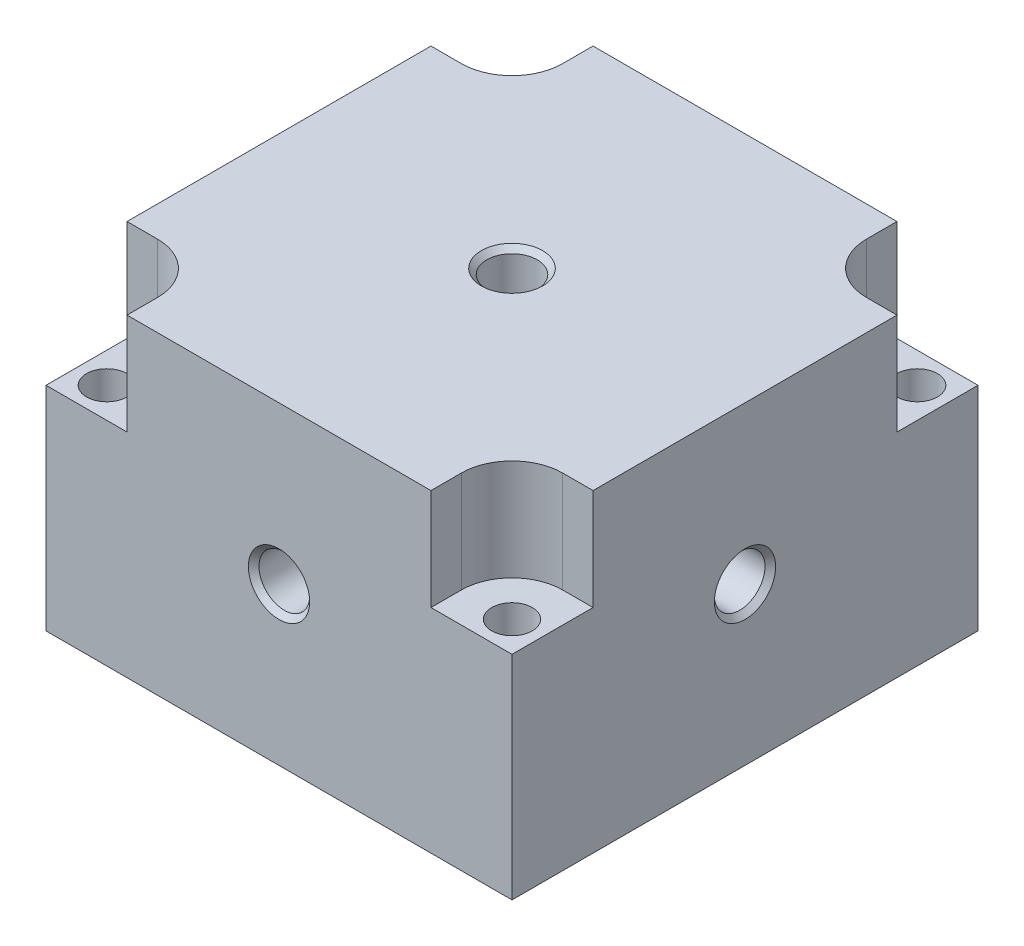
ISO-10303-21;
HEADER;
FILE_DESCRIPTION(('STEP AP214'),'2;1');
FILE_NAME('part.step','',(''),(''),'','','');
FILE_SCHEMA(('AUTOMOTIVE_DESIGN { 1 0 10303 214 1 1 1 1 }'));
ENDSEC;
DATA;
#1=APPLICATION_CONTEXT('core data for automotive mechanical design processes');
#2=APPLICATION_PROTOCOL_DEFINITION('international standard','automotive_design',2000,#1);
#3=PRODUCT_CONTEXT('',#1,'mechanical');
#4=PRODUCT('Part','Part','',(#3));
#5=PRODUCT_RELATED_PRODUCT_CATEGORY('part','',(#4));
#6=PRODUCT_DEFINITION_FORMATION('','',#4);
#7=PRODUCT_DEFINITION_CONTEXT('part definition',#1,'design');
#8=PRODUCT_DEFINITION('design','',#6,#7);
#9=PRODUCT_DEFINITION_SHAPE('','',#8);
#10=(LENGTH_UNIT() NAMED_UNIT(*) SI_UNIT(.MILLI.,.METRE.));
#11=(NAMED_UNIT(*) PLANE_ANGLE_UNIT() SI_UNIT($,.RADIAN.));
#12=(NAMED_UNIT(*) SI_UNIT($,.STERADIAN.) SOLID_ANGLE_UNIT());
#13=UNCERTAINTY_MEASURE_WITH_UNIT(LENGTH_MEASURE(1.E-05),#10,'distance_accuracy_value','');
#14=(GEOMETRIC_REPRESENTATION_CONTEXT(3) GLOBAL_UNCERTAINTY_ASSIGNED_CONTEXT((#13)) GLOBAL_UNIT_ASSIGNED_CONTEXT((#10,
#11,#12)) REPRESENTATION_CONTEXT('',''));
#15=CARTESIAN_POINT('',(0.,0.,0.));
#16=DIRECTION('',(0.,0.,1.));
#17=DIRECTION('',(1.,0.,0.));
#18=AXIS2_PLACEMENT_3D('',#15,#16,#17);
#19=CARTESIAN_POINT('',(23.,15.5,-23.));
#20=DIRECTION('',(-1.,0.,0.));
#21=DIRECTION('',(0.,0.,1.));
#22=AXIS2_PLACEMENT_3D('',#19,#20,#21);
#23=PLANE('',#22);
#24=CARTESIAN_POINT('',(23.,0.,0.));
#25=DIRECTION('',(1.,0.,0.));
#26=DIRECTION('',(0.,0.,-1.));
#27=AXIS2_PLACEMENT_3D('',#24,#25,#26);
#28=CIRCLE('',#27,3.025);
#29=CARTESIAN_POINT('',(23.,0.,-3.02500000000008));
#30=VERTEX_POINT('',#29);
#31=EDGE_CURVE('E247',#30,#30,#28,.T.);
#32=ORIENTED_EDGE('',*,*,#31,.F.);
#33=EDGE_LOOP('',(#32));
#34=FACE_BOUND('',#33,.T.);
#35=DIRECTION('',(0.,0.,-1.));
#36=VECTOR('',#35,1.);
#37=CARTESIAN_POINT('',(23.,15.5,-23.));
#38=LINE('',#37,#36);
#39=CARTESIAN_POINT('',(23.,15.5,15.));
#40=VERTEX_POINT('',#39);
#41=CARTESIAN_POINT('',(23.,15.5,-15.));
#42=VERTEX_POINT('',#41);
#43=EDGE_CURVE('E468',#40,#42,#38,.T.);
#44=ORIENTED_EDGE('',*,*,#43,.F.);
#45=DIRECTION('',(0.,1.,0.));
#46=VECTOR('',#45,1.);
#47=CARTESIAN_POINT('',(23.,5.5,15.));
#48=LINE('',#47,#46);
#49=CARTESIAN_POINT('',(23.,5.5,15.));
#50=VERTEX_POINT('',#49);
#51=EDGE_CURVE('E337',#50,#40,#48,.T.);
#52=ORIENTED_EDGE('',*,*,#51,.F.);
#53=DIRECTION('',(0.,0.,-1.));
#54=VECTOR('',#53,1.);
#55=CARTESIAN_POINT('',(23.,5.5,15.));
#56=LINE('',#55,#54);
#57=CARTESIAN_POINT('',(23.,5.5,23.));
#58=VERTEX_POINT('',#57);
#59=EDGE_CURVE('E315',#58,#50,#56,.T.);
#60=ORIENTED_EDGE('',*,*,#59,.F.);
#61=DIRECTION('',(0.,-1.,0.));
#62=VECTOR('',#61,1.);
#63=CARTESIAN_POINT('',(23.,15.5,23.));
#64=LINE('',#63,#62);
#65=CARTESIAN_POINT('',(23.,-15.5,23.));
#66=VERTEX_POINT('',#65);
#67=EDGE_CURVE('E485',#58,#66,#64,.T.);
#68=ORIENTED_EDGE('',*,*,#67,.T.);
#69=DIRECTION('',(0.,0.,-1.));
#70=VECTOR('',#69,1.);
#71=CARTESIAN_POINT('',(23.,-15.5,-23.));
#72=LINE('',#71,#70);
#73=CARTESIAN_POINT('',(23.,-15.5,-23.));
#74=VERTEX_POINT('',#73);
#75=EDGE_CURVE('E457',#66,#74,#72,.T.);
#76=ORIENTED_EDGE('',*,*,#75,.T.);
#77=DIRECTION('',(0.,-1.,0.));
#78=VECTOR('',#77,1.);
#79=CARTESIAN_POINT('',(23.,15.5,-23.));
#80=LINE('',#79,#78);
#81=CARTESIAN_POINT('',(23.,5.5,-23.));
#82=VERTEX_POINT('',#81);
#83=EDGE_CURVE('E13',#82,#74,#80,.T.);
#84=ORIENTED_EDGE('',*,*,#83,.F.);
#85=DIRECTION('',(0.,0.,-1.));
#86=VECTOR('',#85,1.);
#87=CARTESIAN_POINT('',(23.,5.5,-15.));
#88=LINE('',#87,#86);
#89=CARTESIAN_POINT('',(23.,5.5,-15.));
#90=VERTEX_POINT('',#89);
#91=EDGE_CURVE('E435',#90,#82,#88,.T.);
#92=ORIENTED_EDGE('',*,*,#91,.F.);
#93=DIRECTION('',(0.,1.,0.));
#94=VECTOR('',#93,1.);
#95=CARTESIAN_POINT('',(23.,5.5,-15.));
#96=LINE('',#95,#94);
#97=EDGE_CURVE('E461',#90,#42,#96,.T.);
#98=ORIENTED_EDGE('',*,*,#97,.T.);
#99=EDGE_LOOP('',(#44,#52,#60,#68,#76,#84,#92,#98));
#100=FACE_BOUND('',#99,.T.);
#101=ADVANCED_FACE('F54',(#34,#100),#23,.F.);
#102=CARTESIAN_POINT('',(-23.,15.5,-23.));
#103=DIRECTION('',(0.,0.,1.));
#104=DIRECTION('',(1.,0.,0.));
#105=AXIS2_PLACEMENT_3D('',#102,#103,#104);
#106=PLANE('',#105);
#107=CARTESIAN_POINT('',(0.,0.,-23.));
#108=DIRECTION('',(0.,0.,-1.));
#109=DIRECTION('',(-1.,0.,0.));
#110=AXIS2_PLACEMENT_3D('',#107,#108,#109);
#111=CIRCLE('',#110,3.025);
#112=CARTESIAN_POINT('',(-3.025,0.,-23.));
#113=VERTEX_POINT('',#112);
#114=EDGE_CURVE('E235',#113,#113,#111,.T.);
#115=ORIENTED_EDGE('',*,*,#114,.F.);
#116=EDGE_LOOP('',(#115));
#117=FACE_BOUND('',#116,.T.);
#118=DIRECTION('',(-1.,0.,0.));
#119=VECTOR('',#118,1.);
#120=CARTESIAN_POINT('',(-15.,5.5,-23.));
#121=LINE('',#120,#119);
#122=CARTESIAN_POINT('',(-15.,5.5,-23.));
#123=VERTEX_POINT('',#122);
#124=CARTESIAN_POINT('',(-23.,5.5,-23.));
#125=VERTEX_POINT('',#124);
#126=EDGE_CURVE('E396',#123,#125,#121,.T.);
#127=ORIENTED_EDGE('',*,*,#126,.F.);
#128=DIRECTION('',(0.,1.,0.));
#129=VECTOR('',#128,1.);
#130=CARTESIAN_POINT('',(-15.,5.5,-23.));
#131=LINE('',#130,#129);
#132=CARTESIAN_POINT('',(-15.,15.5,-23.));
#133=VERTEX_POINT('',#132);
#134=EDGE_CURVE('E420',#123,#133,#131,.T.);
#135=ORIENTED_EDGE('',*,*,#134,.T.);
#136=DIRECTION('',(-1.,0.,0.));
#137=VECTOR('',#136,1.);
#138=CARTESIAN_POINT('',(-23.,15.5,-23.));
#139=LINE('',#138,#137);
#140=CARTESIAN_POINT('',(15.,15.5,-23.));
#141=VERTEX_POINT('',#140);
#142=EDGE_CURVE('E472',#141,#133,#139,.T.);
#143=ORIENTED_EDGE('',*,*,#142,.F.);
#144=DIRECTION('',(0.,1.,0.));
#145=VECTOR('',#144,1.);
#146=CARTESIAN_POINT('',(15.,5.5,-23.));
#147=LINE('',#146,#145);
#148=CARTESIAN_POINT('',(15.,5.5,-23.));
#149=VERTEX_POINT('',#148);
#150=EDGE_CURVE('E458',#149,#141,#147,.T.);
#151=ORIENTED_EDGE('',*,*,#150,.F.);
#152=DIRECTION('',(-1.,0.,0.));
#153=VECTOR('',#152,1.);
#154=CARTESIAN_POINT('',(15.,5.5,-23.));
#155=LINE('',#154,#153);
#156=EDGE_CURVE('E438',#82,#149,#155,.T.);
#157=ORIENTED_EDGE('',*,*,#156,.F.);
#158=ORIENTED_EDGE('',*,*,#83,.T.);
#159=DIRECTION('',(-1.,0.,0.));
#160=VECTOR('',#159,1.);
#161=CARTESIAN_POINT('',(-23.,-15.5,-23.));
#162=LINE('',#161,#160);
#163=CARTESIAN_POINT('',(-23.,-15.5,-23.));
#164=VERTEX_POINT('',#163);
#165=EDGE_CURVE('E489',#74,#164,#162,.T.);
#166=ORIENTED_EDGE('',*,*,#165,.T.);
#167=DIRECTION('',(0.,-1.,0.));
#168=VECTOR('',#167,1.);
#169=CARTESIAN_POINT('',(-23.,15.5,-23.));
#170=LINE('',#169,#168);
#171=EDGE_CURVE('E62',#125,#164,#170,.T.);
#172=ORIENTED_EDGE('',*,*,#171,.F.);
#173=EDGE_LOOP('',(#127,#135,#143,#151,#157,#158,#166,#172));
#174=FACE_BOUND('',#173,.T.);
#175=ADVANCED_FACE('F518',(#117,#174),#106,.F.);
#176=CARTESIAN_POINT('',(-23.,15.5,-23.));
#177=DIRECTION('',(1.,0.,0.));
#178=DIRECTION('',(0.,0.,-1.));
#179=AXIS2_PLACEMENT_3D('',#176,#177,#178);
#180=PLANE('',#179);
#181=CARTESIAN_POINT('',(-23.,0.,2.40912212380176E-13));
#182=DIRECTION('',(-1.,0.,0.));
#183=DIRECTION('',(0.,0.,1.));
#184=AXIS2_PLACEMENT_3D('',#181,#182,#183);
#185=CIRCLE('',#184,3.025);
#186=CARTESIAN_POINT('',(-23.,0.,3.02500000000024));
#187=VERTEX_POINT('',#186);
#188=EDGE_CURVE('E214',#187,#187,#185,.T.);
#189=ORIENTED_EDGE('',*,*,#188,.F.);
#190=EDGE_LOOP('',(#189));
#191=FACE_BOUND('',#190,.T.);
#192=DIRECTION('',(0.,0.,1.));
#193=VECTOR('',#192,1.);
#194=CARTESIAN_POINT('',(-23.,15.5,-23.));
#195=LINE('',#194,#193);
#196=CARTESIAN_POINT('',(-23.,15.5,-15.));
#197=VERTEX_POINT('',#196);
#198=CARTESIAN_POINT('',(-23.,15.5,15.));
#199=VERTEX_POINT('',#198);
#200=EDGE_CURVE('E477',#197,#199,#195,.T.);
#201=ORIENTED_EDGE('',*,*,#200,.F.);
#202=DIRECTION('',(0.,1.,0.));
#203=VECTOR('',#202,1.);
#204=CARTESIAN_POINT('',(-23.,5.5,-15.));
#205=LINE('',#204,#203);
#206=CARTESIAN_POINT('',(-23.,5.5,-15.));
#207=VERTEX_POINT('',#206);
#208=EDGE_CURVE('E417',#207,#197,#205,.T.);
#209=ORIENTED_EDGE('',*,*,#208,.F.);
#210=DIRECTION('',(0.,0.,1.));
#211=VECTOR('',#210,1.);
#212=CARTESIAN_POINT('',(-23.,5.5,-15.));
#213=LINE('',#212,#211);
#214=EDGE_CURVE('E399',#125,#207,#213,.T.);
#215=ORIENTED_EDGE('',*,*,#214,.F.);
#216=ORIENTED_EDGE('',*,*,#171,.T.);
#217=DIRECTION('',(0.,0.,1.));
#218=VECTOR('',#217,1.);
#219=CARTESIAN_POINT('',(-23.,-15.5,-23.));
#220=LINE('',#219,#218);
#221=CARTESIAN_POINT('',(-23.,-15.5,23.));
#222=VERTEX_POINT('',#221);
#223=EDGE_CURVE('E493',#164,#222,#220,.T.);
#224=ORIENTED_EDGE('',*,*,#223,.T.);
#225=DIRECTION('',(0.,-1.,0.));
#226=VECTOR('',#225,1.);
#227=CARTESIAN_POINT('',(-23.,15.5,23.));
#228=LINE('',#227,#226);
#229=CARTESIAN_POINT('',(-23.,5.5,23.));
#230=VERTEX_POINT('',#229);
#231=EDGE_CURVE('E502',#230,#222,#228,.T.);
#232=ORIENTED_EDGE('',*,*,#231,.F.);
#233=DIRECTION('',(0.,0.,1.));
#234=VECTOR('',#233,1.);
#235=CARTESIAN_POINT('',(-23.,5.5,15.));
#236=LINE('',#235,#234);
#237=CARTESIAN_POINT('',(-23.,5.5,15.));
#238=VERTEX_POINT('',#237);
#239=EDGE_CURVE('E356',#238,#230,#236,.T.);
#240=ORIENTED_EDGE('',*,*,#239,.F.);
#241=DIRECTION('',(0.,1.,0.));
#242=VECTOR('',#241,1.);
#243=CARTESIAN_POINT('',(-23.,5.5,15.));
#244=LINE('',#243,#242);
#245=EDGE_CURVE('E381',#238,#199,#244,.T.);
#246=ORIENTED_EDGE('',*,*,#245,.T.);
#247=EDGE_LOOP('',(#201,#209,#215,#216,#224,#232,#240,#246));
#248=FACE_BOUND('',#247,.T.);
#249=ADVANCED_FACE('F510',(#191,#248),#180,.F.);
#250=CARTESIAN_POINT('',(-23.,15.5,23.));
#251=DIRECTION('',(0.,0.,-1.));
#252=DIRECTION('',(-1.,0.,0.));
#253=AXIS2_PLACEMENT_3D('',#250,#251,#252);
#254=PLANE('',#253);
#255=CARTESIAN_POINT('',(0.,0.,23.));
#256=DIRECTION('',(0.,0.,1.));
#257=DIRECTION('',(1.,0.,0.));
#258=AXIS2_PLACEMENT_3D('',#255,#256,#257);
#259=CIRCLE('',#258,3.025);
#260=CARTESIAN_POINT('',(3.025,0.,23.));
#261=VERTEX_POINT('',#260);
#262=EDGE_CURVE('E259',#261,#261,#259,.T.);
#263=ORIENTED_EDGE('',*,*,#262,.F.);
#264=EDGE_LOOP('',(#263));
#265=FACE_BOUND('',#264,.T.);
#266=DIRECTION('',(1.,0.,0.));
#267=VECTOR('',#266,1.);
#268=CARTESIAN_POINT('',(-23.,15.5,23.));
#269=LINE('',#268,#267);
#270=CARTESIAN_POINT('',(-15.,15.5,23.));
#271=VERTEX_POINT('',#270);
#272=CARTESIAN_POINT('',(15.,15.5,23.));
#273=VERTEX_POINT('',#272);
#274=EDGE_CURVE('E481',#271,#273,#269,.T.);
#275=ORIENTED_EDGE('',*,*,#274,.F.);
#276=DIRECTION('',(0.,1.,0.));
#277=VECTOR('',#276,1.);
#278=CARTESIAN_POINT('',(-15.,5.5,23.));
#279=LINE('',#278,#277);
#280=CARTESIAN_POINT('',(-15.,5.5,23.));
#281=VERTEX_POINT('',#280);
#282=EDGE_CURVE('E378',#281,#271,#279,.T.);
#283=ORIENTED_EDGE('',*,*,#282,.F.);
#284=DIRECTION('',(1.,0.,0.));
#285=VECTOR('',#284,1.);
#286=CARTESIAN_POINT('',(-15.,5.5,23.));
#287=LINE('',#286,#285);
#288=EDGE_CURVE('E359',#230,#281,#287,.T.);
#289=ORIENTED_EDGE('',*,*,#288,.F.);
#290=ORIENTED_EDGE('',*,*,#231,.T.);
#291=DIRECTION('',(1.,0.,0.));
#292=VECTOR('',#291,1.);
#293=CARTESIAN_POINT('',(-23.,-15.5,23.));
#294=LINE('',#293,#292);
#295=EDGE_CURVE('E473',#222,#66,#294,.T.);
#296=ORIENTED_EDGE('',*,*,#295,.T.);
#297=ORIENTED_EDGE('',*,*,#67,.F.);
#298=DIRECTION('',(1.,0.,0.));
#299=VECTOR('',#298,1.);
#300=CARTESIAN_POINT('',(15.,5.5,23.));
#301=LINE('',#300,#299);
#302=CARTESIAN_POINT('',(15.,5.5,23.));
#303=VERTEX_POINT('',#302);
#304=EDGE_CURVE('E312',#303,#58,#301,.T.);
#305=ORIENTED_EDGE('',*,*,#304,.F.);
#306=DIRECTION('',(0.,1.,0.));
#307=VECTOR('',#306,1.);
#308=CARTESIAN_POINT('',(15.,5.5,23.));
#309=LINE('',#308,#307);
#310=EDGE_CURVE('E340',#303,#273,#309,.T.);
#311=ORIENTED_EDGE('',*,*,#310,.T.);
#312=EDGE_LOOP('',(#275,#283,#289,#290,#296,#297,#305,#311));
#313=FACE_BOUND('',#312,.T.);
#314=ADVANCED_FACE('F527',(#265,#313),#254,.F.);
#315=CARTESIAN_POINT('',(0.,15.5,0.));
#316=DIRECTION('',(0.,1.,0.));
#317=DIRECTION('',(0.,0.,1.));
#318=AXIS2_PLACEMENT_3D('',#315,#316,#317);
#319=PLANE('',#318);
#320=CARTESIAN_POINT('',(0.,15.5,0.));
#321=DIRECTION('',(0.,1.,0.));
#322=DIRECTION('',(0.,0.,1.));
#323=AXIS2_PLACEMENT_3D('',#320,#321,#322);
#324=CIRCLE('',#323,3.025);
#325=CARTESIAN_POINT('',(0.,15.5,3.025));
#326=VERTEX_POINT('',#325);
#327=EDGE_CURVE('E224',#326,#326,#324,.T.);
#328=ORIENTED_EDGE('',*,*,#327,.F.);
#329=EDGE_LOOP('',(#328));
#330=FACE_BOUND('',#329,.T.);
#331=DIRECTION('',(1.,0.,0.));
#332=VECTOR('',#331,1.);
#333=CARTESIAN_POINT('',(-20.,15.5,-15.));
#334=LINE('',#333,#332);
#335=CARTESIAN_POINT('',(-20.,15.5,-15.));
#336=VERTEX_POINT('',#335);
#337=EDGE_CURVE('E392',#197,#336,#334,.T.);
#338=ORIENTED_EDGE('',*,*,#337,.F.);
#339=ORIENTED_EDGE('',*,*,#200,.T.);
#340=DIRECTION('',(-1.,0.,0.));
#341=VECTOR('',#340,1.);
#342=CARTESIAN_POINT('',(-20.,15.5,15.));
#343=LINE('',#342,#341);
#344=CARTESIAN_POINT('',(-20.,15.5,15.));
#345=VERTEX_POINT('',#344);
#346=EDGE_CURVE('E369',#345,#199,#343,.T.);
#347=ORIENTED_EDGE('',*,*,#346,.F.);
#348=CARTESIAN_POINT('',(-20.,15.5,20.));
#349=DIRECTION('',(0.,1.,0.));
#350=DIRECTION('',(0.,0.,1.));
#351=AXIS2_PLACEMENT_3D('',#348,#349,#350);
#352=CIRCLE('',#351,5.);
#353=CARTESIAN_POINT('',(-15.,15.5,20.));
#354=VERTEX_POINT('',#353);
#355=EDGE_CURVE('E77',#354,#345,#352,.T.);
#356=ORIENTED_EDGE('',*,*,#355,.F.);
#357=DIRECTION('',(0.,0.,-1.));
#358=VECTOR('',#357,1.);
#359=CARTESIAN_POINT('',(-15.,15.5,20.));
#360=LINE('',#359,#358);
#361=EDGE_CURVE('E352',#271,#354,#360,.T.);
#362=ORIENTED_EDGE('',*,*,#361,.F.);
#363=ORIENTED_EDGE('',*,*,#274,.T.);
#364=DIRECTION('',(0.,0.,1.));
#365=VECTOR('',#364,1.);
#366=CARTESIAN_POINT('',(15.,15.5,20.));
#367=LINE('',#366,#365);
#368=CARTESIAN_POINT('',(15.,15.5,20.));
#369=VERTEX_POINT('',#368);
#370=EDGE_CURVE('E326',#369,#273,#367,.T.);
#371=ORIENTED_EDGE('',*,*,#370,.F.);
#372=CARTESIAN_POINT('',(20.,15.5,20.));
#373=DIRECTION('',(0.,1.,0.));
#374=DIRECTION('',(0.,0.,1.));
#375=AXIS2_PLACEMENT_3D('',#372,#373,#374);
#376=CIRCLE('',#375,5.);
#377=CARTESIAN_POINT('',(20.,15.5,15.));
#378=VERTEX_POINT('',#377);
#379=EDGE_CURVE('E323',#378,#369,#376,.T.);
#380=ORIENTED_EDGE('',*,*,#379,.F.);
#381=DIRECTION('',(-1.,0.,0.));
#382=VECTOR('',#381,1.);
#383=CARTESIAN_POINT('',(20.,15.5,15.));
#384=LINE('',#383,#382);
#385=EDGE_CURVE('E308',#40,#378,#384,.T.);
#386=ORIENTED_EDGE('',*,*,#385,.F.);
#387=ORIENTED_EDGE('',*,*,#43,.T.);
#388=DIRECTION('',(1.,0.,0.));
#389=VECTOR('',#388,1.);
#390=CARTESIAN_POINT('',(20.,15.5,-15.));
#391=LINE('',#390,#389);
#392=CARTESIAN_POINT('',(20.,15.5,-15.));
#393=VERTEX_POINT('',#392);
#394=EDGE_CURVE('E448',#393,#42,#391,.T.);
#395=ORIENTED_EDGE('',*,*,#394,.F.);
#396=CARTESIAN_POINT('',(20.,15.5,-20.));
#397=DIRECTION('',(0.,1.,0.));
#398=DIRECTION('',(0.,0.,1.));
#399=AXIS2_PLACEMENT_3D('',#396,#397,#398);
#400=CIRCLE('',#399,5.);
#401=CARTESIAN_POINT('',(15.,15.5,-20.));
#402=VERTEX_POINT('',#401);
#403=EDGE_CURVE('E336',#402,#393,#400,.T.);
#404=ORIENTED_EDGE('',*,*,#403,.F.);
#405=DIRECTION('',(0.,0.,1.));
#406=VECTOR('',#405,1.);
#407=CARTESIAN_POINT('',(15.,15.5,-20.));
#408=LINE('',#407,#406);
#409=EDGE_CURVE('E431',#141,#402,#408,.T.);
#410=ORIENTED_EDGE('',*,*,#409,.F.);
#411=ORIENTED_EDGE('',*,*,#142,.T.);
#412=DIRECTION('',(0.,0.,-1.));
#413=VECTOR('',#412,1.);
#414=CARTESIAN_POINT('',(-15.,15.5,-20.));
#415=LINE('',#414,#413);
#416=CARTESIAN_POINT('',(-15.,15.5,-20.));
#417=VERTEX_POINT('',#416);
#418=EDGE_CURVE('E409',#417,#133,#415,.T.);
#419=ORIENTED_EDGE('',*,*,#418,.F.);
#420=CARTESIAN_POINT('',(-20.,15.5,-20.));
#421=DIRECTION('',(0.,1.,0.));
#422=DIRECTION('',(0.,0.,1.));
#423=AXIS2_PLACEMENT_3D('',#420,#421,#422);
#424=CIRCLE('',#423,5.);
#425=EDGE_CURVE('E69',#336,#417,#424,.T.);
#426=ORIENTED_EDGE('',*,*,#425,.F.);
#427=EDGE_LOOP('',(#338,#339,#347,#356,#362,#363,#371,#380,#386,#387,#395,#404,#410,#411,#419,#426));
#428=FACE_BOUND('',#427,.T.);
#429=ADVANCED_FACE('F542',(#330,#428),#319,.T.);
#430=CARTESIAN_POINT('',(0.,-15.5,0.));
#431=DIRECTION('',(0.,1.,0.));
#432=DIRECTION('',(0.,0.,1.));
#433=AXIS2_PLACEMENT_3D('',#430,#431,#432);
#434=PLANE('',#433);
#435=CARTESIAN_POINT('',(-20.,-15.5,-20.));
#436=DIRECTION('',(0.,1.,0.));
#437=DIRECTION('',(0.,0.,1.));
#438=AXIS2_PLACEMENT_3D('',#435,#436,#437);
#439=CIRCLE('',#438,2.00000000000001);
#440=CARTESIAN_POINT('',(-20.,-15.5,-18.));
#441=VERTEX_POINT('',#440);
#442=EDGE_CURVE('E289',#441,#441,#439,.T.);
#443=ORIENTED_EDGE('',*,*,#442,.T.);
#444=EDGE_LOOP('',(#443));
#445=FACE_BOUND('',#444,.T.);
#446=CARTESIAN_POINT('',(-20.,-15.5,20.));
#447=DIRECTION('',(0.,1.,0.));
#448=DIRECTION('',(0.,0.,1.));
#449=AXIS2_PLACEMENT_3D('',#446,#447,#448);
#450=CIRCLE('',#449,2.00000000000001);
#451=CARTESIAN_POINT('',(-20.,-15.5,22.));
#452=VERTEX_POINT('',#451);
#453=EDGE_CURVE('E281',#452,#452,#450,.T.);
#454=ORIENTED_EDGE('',*,*,#453,.T.);
#455=EDGE_LOOP('',(#454));
#456=FACE_BOUND('',#455,.T.);
#457=CARTESIAN_POINT('',(20.,-15.5,20.));
#458=DIRECTION('',(0.,1.,0.));
#459=DIRECTION('',(0.,0.,1.));
#460=AXIS2_PLACEMENT_3D('',#457,#458,#459);
#461=CIRCLE('',#460,2.00000000000001);
#462=CARTESIAN_POINT('',(20.,-15.5,22.));
#463=VERTEX_POINT('',#462);
#464=EDGE_CURVE('E272',#463,#463,#461,.T.);
#465=ORIENTED_EDGE('',*,*,#464,.T.);
#466=EDGE_LOOP('',(#465));
#467=FACE_BOUND('',#466,.T.);
#468=CARTESIAN_POINT('',(20.,-15.5,-20.));
#469=DIRECTION('',(0.,1.,0.));
#470=DIRECTION('',(0.,0.,1.));
#471=AXIS2_PLACEMENT_3D('',#468,#469,#470);
#472=CIRCLE('',#471,2.00000000000001);
#473=CARTESIAN_POINT('',(20.,-15.5,-18.));
#474=VERTEX_POINT('',#473);
#475=EDGE_CURVE('E296',#474,#474,#472,.T.);
#476=ORIENTED_EDGE('',*,*,#475,.T.);
#477=EDGE_LOOP('',(#476));
#478=FACE_BOUND('',#477,.T.);
#479=ORIENTED_EDGE('',*,*,#75,.F.);
#480=ORIENTED_EDGE('',*,*,#295,.F.);
#481=ORIENTED_EDGE('',*,*,#223,.F.);
#482=ORIENTED_EDGE('',*,*,#165,.F.);
#483=EDGE_LOOP('',(#479,#480,#481,#482));
#484=FACE_BOUND('',#483,.T.);
#485=ADVANCED_FACE('F523',(#445,#456,#467,#478,#484),#434,.F.);
#486=CARTESIAN_POINT('',(20.,5.5,-20.));
#487=DIRECTION('',(0.,1.,0.));
#488=DIRECTION('',(0.,0.,1.));
#489=AXIS2_PLACEMENT_3D('',#486,#487,#488);
#490=CYLINDRICAL_SURFACE('',#489,5.);
#491=ORIENTED_EDGE('',*,*,#403,.T.);
#492=DIRECTION('',(0.,1.,0.));
#493=VECTOR('',#492,1.);
#494=CARTESIAN_POINT('',(20.,5.5,-15.));
#495=LINE('',#494,#493);
#496=CARTESIAN_POINT('',(20.,5.5,-15.));
#497=VERTEX_POINT('',#496);
#498=EDGE_CURVE('E445',#497,#393,#495,.T.);
#499=ORIENTED_EDGE('',*,*,#498,.F.);
#500=CARTESIAN_POINT('',(20.,5.5,-20.));
#501=DIRECTION('',(0.,1.,0.));
#502=DIRECTION('',(0.,0.,1.));
#503=AXIS2_PLACEMENT_3D('',#500,#501,#502);
#504=CIRCLE('',#503,5.);
#505=CARTESIAN_POINT('',(15.,5.5,-20.));
#506=VERTEX_POINT('',#505);
#507=EDGE_CURVE('E426',#506,#497,#504,.T.);
#508=ORIENTED_EDGE('',*,*,#507,.F.);
#509=DIRECTION('',(0.,1.,0.));
#510=VECTOR('',#509,1.);
#511=CARTESIAN_POINT('',(15.,5.5,-20.));
#512=LINE('',#511,#510);
#513=EDGE_CURVE('E454',#506,#402,#512,.T.);
#514=ORIENTED_EDGE('',*,*,#513,.T.);
#515=EDGE_LOOP('',(#491,#499,#508,#514));
#516=FACE_BOUND('',#515,.T.);
#517=ADVANCED_FACE('F968',(#516),#490,.F.);
#518=CARTESIAN_POINT('',(15.,5.5,-20.));
#519=DIRECTION('',(-1.,0.,0.));
#520=DIRECTION('',(0.,0.,1.));
#521=AXIS2_PLACEMENT_3D('',#518,#519,#520);
#522=PLANE('',#521);
#523=ORIENTED_EDGE('',*,*,#409,.T.);
#524=ORIENTED_EDGE('',*,*,#513,.F.);
#525=DIRECTION('',(0.,0.,1.));
#526=VECTOR('',#525,1.);
#527=CARTESIAN_POINT('',(15.,5.5,-20.));
#528=LINE('',#527,#526);
#529=EDGE_CURVE('E441',#149,#506,#528,.T.);
#530=ORIENTED_EDGE('',*,*,#529,.F.);
#531=ORIENTED_EDGE('',*,*,#150,.T.);
#532=EDGE_LOOP('',(#523,#524,#530,#531));
#533=FACE_BOUND('',#532,.T.);
#534=ADVANCED_FACE('F559',(#533),#522,.F.);
#535=CARTESIAN_POINT('',(20.,5.5,-15.));
#536=DIRECTION('',(0.,0.,1.));
#537=DIRECTION('',(1.,0.,0.));
#538=AXIS2_PLACEMENT_3D('',#535,#536,#537);
#539=PLANE('',#538);
#540=ORIENTED_EDGE('',*,*,#394,.T.);
#541=ORIENTED_EDGE('',*,*,#97,.F.);
#542=DIRECTION('',(1.,0.,0.));
#543=VECTOR('',#542,1.);
#544=CARTESIAN_POINT('',(20.,5.5,-15.));
#545=LINE('',#544,#543);
#546=EDGE_CURVE('E430',#497,#90,#545,.T.);
#547=ORIENTED_EDGE('',*,*,#546,.F.);
#548=ORIENTED_EDGE('',*,*,#498,.T.);
#549=EDGE_LOOP('',(#540,#541,#547,#548));
#550=FACE_BOUND('',#549,.T.);
#551=ADVANCED_FACE('F956',(#550),#539,.F.);
#552=CARTESIAN_POINT('',(20.,5.5,-20.));
#553=DIRECTION('',(0.,1.,0.));
#554=DIRECTION('',(0.,0.,1.));
#555=AXIS2_PLACEMENT_3D('',#552,#553,#554);
#556=PLANE('',#555);
#557=CARTESIAN_POINT('',(20.,5.5,-20.));
#558=DIRECTION('',(0.,1.,0.));
#559=DIRECTION('',(0.,0.,1.));
#560=AXIS2_PLACEMENT_3D('',#557,#558,#559);
#561=CIRCLE('',#560,2.00000000000001);
#562=CARTESIAN_POINT('',(20.,5.5,-18.));
#563=VERTEX_POINT('',#562);
#564=EDGE_CURVE('E276',#563,#563,#561,.T.);
#565=ORIENTED_EDGE('',*,*,#564,.F.);
#566=EDGE_LOOP('',(#565));
#567=FACE_BOUND('',#566,.T.);
#568=ORIENTED_EDGE('',*,*,#507,.T.);
#569=ORIENTED_EDGE('',*,*,#546,.T.);
#570=ORIENTED_EDGE('',*,*,#91,.T.);
#571=ORIENTED_EDGE('',*,*,#156,.T.);
#572=ORIENTED_EDGE('',*,*,#529,.T.);
#573=EDGE_LOOP('',(#568,#569,#570,#571,#572));
#574=FACE_BOUND('',#573,.T.);
#575=ADVANCED_FACE('F660',(#567,#574),#556,.T.);
#576=CARTESIAN_POINT('',(20.,5.5,20.));
#577=DIRECTION('',(0.,1.,0.));
#578=DIRECTION('',(0.,0.,1.));
#579=AXIS2_PLACEMENT_3D('',#576,#577,#578);
#580=CYLINDRICAL_SURFACE('',#579,5.);
#581=ORIENTED_EDGE('',*,*,#379,.T.);
#582=DIRECTION('',(0.,1.,0.));
#583=VECTOR('',#582,1.);
#584=CARTESIAN_POINT('',(15.,5.5,20.));
#585=LINE('',#584,#583);
#586=CARTESIAN_POINT('',(15.,5.5,20.));
#587=VERTEX_POINT('',#586);
#588=EDGE_CURVE('E322',#587,#369,#585,.T.);
#589=ORIENTED_EDGE('',*,*,#588,.F.);
#590=CARTESIAN_POINT('',(20.,5.5,20.));
#591=DIRECTION('',(0.,1.,0.));
#592=DIRECTION('',(0.,0.,1.));
#593=AXIS2_PLACEMENT_3D('',#590,#591,#592);
#594=CIRCLE('',#593,5.);
#595=CARTESIAN_POINT('',(20.,5.5,15.));
#596=VERTEX_POINT('',#595);
#597=EDGE_CURVE('E303',#596,#587,#594,.T.);
#598=ORIENTED_EDGE('',*,*,#597,.F.);
#599=DIRECTION('',(0.,1.,0.));
#600=VECTOR('',#599,1.);
#601=CARTESIAN_POINT('',(20.,5.5,15.));
#602=LINE('',#601,#600);
#603=EDGE_CURVE('E333',#596,#378,#602,.T.);
#604=ORIENTED_EDGE('',*,*,#603,.T.);
#605=EDGE_LOOP('',(#581,#589,#598,#604));
#606=FACE_BOUND('',#605,.T.);
#607=ADVANCED_FACE('F577',(#606),#580,.F.);
#608=CARTESIAN_POINT('',(20.,5.5,15.));
#609=DIRECTION('',(0.,0.,-1.));
#610=DIRECTION('',(-1.,0.,0.));
#611=AXIS2_PLACEMENT_3D('',#608,#609,#610);
#612=PLANE('',#611);
#613=ORIENTED_EDGE('',*,*,#385,.T.);
#614=ORIENTED_EDGE('',*,*,#603,.F.);
#615=DIRECTION('',(-1.,0.,0.));
#616=VECTOR('',#615,1.);
#617=CARTESIAN_POINT('',(20.,5.5,15.));
#618=LINE('',#617,#616);
#619=EDGE_CURVE('E318',#50,#596,#618,.T.);
#620=ORIENTED_EDGE('',*,*,#619,.F.);
#621=ORIENTED_EDGE('',*,*,#51,.T.);
#622=EDGE_LOOP('',(#613,#614,#620,#621));
#623=FACE_BOUND('',#622,.T.);
#624=ADVANCED_FACE('F572',(#623),#612,.F.);
#625=CARTESIAN_POINT('',(15.,5.5,20.));
#626=DIRECTION('',(-1.,0.,0.));
#627=DIRECTION('',(0.,0.,1.));
#628=AXIS2_PLACEMENT_3D('',#625,#626,#627);
#629=PLANE('',#628);
#630=ORIENTED_EDGE('',*,*,#370,.T.);
#631=ORIENTED_EDGE('',*,*,#310,.F.);
#632=DIRECTION('',(0.,0.,1.));
#633=VECTOR('',#632,1.);
#634=CARTESIAN_POINT('',(15.,5.5,20.));
#635=LINE('',#634,#633);
#636=EDGE_CURVE('E307',#587,#303,#635,.T.);
#637=ORIENTED_EDGE('',*,*,#636,.F.);
#638=ORIENTED_EDGE('',*,*,#588,.T.);
#639=EDGE_LOOP('',(#630,#631,#637,#638));
#640=FACE_BOUND('',#639,.T.);
#641=ADVANCED_FACE('F591',(#640),#629,.F.);
#642=CARTESIAN_POINT('',(20.,5.5,20.));
#643=DIRECTION('',(0.,1.,0.));
#644=DIRECTION('',(0.,0.,1.));
#645=AXIS2_PLACEMENT_3D('',#642,#643,#644);
#646=PLANE('',#645);
#647=CARTESIAN_POINT('',(20.,5.5,20.));
#648=DIRECTION('',(0.,1.,0.));
#649=DIRECTION('',(0.,0.,1.));
#650=AXIS2_PLACEMENT_3D('',#647,#648,#649);
#651=CIRCLE('',#650,2.00000000000001);
#652=CARTESIAN_POINT('',(20.,5.5,22.));
#653=VERTEX_POINT('',#652);
#654=EDGE_CURVE('E277',#653,#653,#651,.T.);
#655=ORIENTED_EDGE('',*,*,#654,.F.);
#656=EDGE_LOOP('',(#655));
#657=FACE_BOUND('',#656,.T.);
#658=ORIENTED_EDGE('',*,*,#597,.T.);
#659=ORIENTED_EDGE('',*,*,#636,.T.);
#660=ORIENTED_EDGE('',*,*,#304,.T.);
#661=ORIENTED_EDGE('',*,*,#59,.T.);
#662=ORIENTED_EDGE('',*,*,#619,.T.);
#663=EDGE_LOOP('',(#658,#659,#660,#661,#662));
#664=FACE_BOUND('',#663,.T.);
#665=ADVANCED_FACE('F570',(#657,#664),#646,.T.);
#666=CARTESIAN_POINT('',(-20.,5.5,20.));
#667=DIRECTION('',(0.,1.,0.));
#668=DIRECTION('',(0.,0.,1.));
#669=AXIS2_PLACEMENT_3D('',#666,#667,#668);
#670=CYLINDRICAL_SURFACE('',#669,5.);
#671=ORIENTED_EDGE('',*,*,#355,.T.);
#672=DIRECTION('',(0.,1.,0.));
#673=VECTOR('',#672,1.);
#674=CARTESIAN_POINT('',(-20.,5.5,15.));
#675=LINE('',#674,#673);
#676=CARTESIAN_POINT('',(-20.,5.5,15.));
#677=VERTEX_POINT('',#676);
#678=EDGE_CURVE('E366',#677,#345,#675,.T.);
#679=ORIENTED_EDGE('',*,*,#678,.F.);
#680=CARTESIAN_POINT('',(-20.,5.5,20.));
#681=DIRECTION('',(0.,1.,0.));
#682=DIRECTION('',(0.,0.,1.));
#683=AXIS2_PLACEMENT_3D('',#680,#681,#682);
#684=CIRCLE('',#683,5.);
#685=CARTESIAN_POINT('',(-15.,5.5,20.));
#686=VERTEX_POINT('',#685);
#687=EDGE_CURVE('E347',#686,#677,#684,.T.);
#688=ORIENTED_EDGE('',*,*,#687,.F.);
#689=DIRECTION('',(0.,1.,0.));
#690=VECTOR('',#689,1.);
#691=CARTESIAN_POINT('',(-15.,5.5,20.));
#692=LINE('',#691,#690);
#693=EDGE_CURVE('E327',#686,#354,#692,.T.);
#694=ORIENTED_EDGE('',*,*,#693,.T.);
#695=EDGE_LOOP('',(#671,#679,#688,#694));
#696=FACE_BOUND('',#695,.T.);
#697=ADVANCED_FACE('F583',(#696),#670,.F.);
#698=CARTESIAN_POINT('',(-15.,5.5,20.));
#699=DIRECTION('',(1.,0.,0.));
#700=DIRECTION('',(0.,0.,-1.));
#701=AXIS2_PLACEMENT_3D('',#698,#699,#700);
#702=PLANE('',#701);
#703=ORIENTED_EDGE('',*,*,#361,.T.);
#704=ORIENTED_EDGE('',*,*,#693,.F.);
#705=DIRECTION('',(0.,0.,-1.));
#706=VECTOR('',#705,1.);
#707=CARTESIAN_POINT('',(-15.,5.5,20.));
#708=LINE('',#707,#706);
#709=EDGE_CURVE('E362',#281,#686,#708,.T.);
#710=ORIENTED_EDGE('',*,*,#709,.F.);
#711=ORIENTED_EDGE('',*,*,#282,.T.);
#712=EDGE_LOOP('',(#703,#704,#710,#711));
#713=FACE_BOUND('',#712,.T.);
#714=ADVANCED_FACE('F582',(#713),#702,.F.);
#715=CARTESIAN_POINT('',(-20.,5.5,15.));
#716=DIRECTION('',(0.,0.,-1.));
#717=DIRECTION('',(-1.,0.,0.));
#718=AXIS2_PLACEMENT_3D('',#715,#716,#717);
#719=PLANE('',#718);
#720=ORIENTED_EDGE('',*,*,#346,.T.);
#721=ORIENTED_EDGE('',*,*,#245,.F.);
#722=DIRECTION('',(-1.,0.,0.));
#723=VECTOR('',#722,1.);
#724=CARTESIAN_POINT('',(-20.,5.5,15.));
#725=LINE('',#724,#723);
#726=EDGE_CURVE('E351',#677,#238,#725,.T.);
#727=ORIENTED_EDGE('',*,*,#726,.F.);
#728=ORIENTED_EDGE('',*,*,#678,.T.);
#729=EDGE_LOOP('',(#720,#721,#727,#728));
#730=FACE_BOUND('',#729,.T.);
#731=ADVANCED_FACE('F538',(#730),#719,.F.);
#732=CARTESIAN_POINT('',(-20.,5.5,20.));
#733=DIRECTION('',(0.,1.,0.));
#734=DIRECTION('',(0.,0.,1.));
#735=AXIS2_PLACEMENT_3D('',#732,#733,#734);
#736=PLANE('',#735);
#737=CARTESIAN_POINT('',(-20.,5.5,20.));
#738=DIRECTION('',(0.,1.,0.));
#739=DIRECTION('',(0.,0.,1.));
#740=AXIS2_PLACEMENT_3D('',#737,#738,#739);
#741=CIRCLE('',#740,2.00000000000001);
#742=CARTESIAN_POINT('',(-20.,5.5,22.));
#743=VERTEX_POINT('',#742);
#744=EDGE_CURVE('E285',#743,#743,#741,.T.);
#745=ORIENTED_EDGE('',*,*,#744,.F.);
#746=EDGE_LOOP('',(#745));
#747=FACE_BOUND('',#746,.T.);
#748=ORIENTED_EDGE('',*,*,#687,.T.);
#749=ORIENTED_EDGE('',*,*,#726,.T.);
#750=ORIENTED_EDGE('',*,*,#239,.T.);
#751=ORIENTED_EDGE('',*,*,#288,.T.);
#752=ORIENTED_EDGE('',*,*,#709,.T.);
#753=EDGE_LOOP('',(#748,#749,#750,#751,#752));
#754=FACE_BOUND('',#753,.T.);
#755=ADVANCED_FACE('F533',(#747,#754),#736,.T.);
#756=CARTESIAN_POINT('',(-20.,5.5,-20.));
#757=DIRECTION('',(0.,1.,0.));
#758=DIRECTION('',(0.,0.,1.));
#759=AXIS2_PLACEMENT_3D('',#756,#757,#758);
#760=CYLINDRICAL_SURFACE('',#759,5.);
#761=ORIENTED_EDGE('',*,*,#425,.T.);
#762=DIRECTION('',(0.,1.,0.));
#763=VECTOR('',#762,1.);
#764=CARTESIAN_POINT('',(-15.,5.5,-20.));
#765=LINE('',#764,#763);
#766=CARTESIAN_POINT('',(-15.,5.5,-20.));
#767=VERTEX_POINT('',#766);
#768=EDGE_CURVE('E406',#767,#417,#765,.T.);
#769=ORIENTED_EDGE('',*,*,#768,.F.);
#770=CARTESIAN_POINT('',(-20.,5.5,-20.));
#771=DIRECTION('',(0.,1.,0.));
#772=DIRECTION('',(0.,0.,1.));
#773=AXIS2_PLACEMENT_3D('',#770,#771,#772);
#774=CIRCLE('',#773,5.);
#775=CARTESIAN_POINT('',(-20.,5.5,-15.));
#776=VERTEX_POINT('',#775);
#777=EDGE_CURVE('E387',#776,#767,#774,.T.);
#778=ORIENTED_EDGE('',*,*,#777,.F.);
#779=DIRECTION('',(0.,1.,0.));
#780=VECTOR('',#779,1.);
#781=CARTESIAN_POINT('',(-20.,5.5,-15.));
#782=LINE('',#781,#780);
#783=EDGE_CURVE('E370',#776,#336,#782,.T.);
#784=ORIENTED_EDGE('',*,*,#783,.T.);
#785=EDGE_LOOP('',(#761,#769,#778,#784));
#786=FACE_BOUND('',#785,.T.);
#787=ADVANCED_FACE('F662',(#786),#760,.F.);
#788=CARTESIAN_POINT('',(-20.,5.5,-15.));
#789=DIRECTION('',(0.,0.,1.));
#790=DIRECTION('',(1.,0.,0.));
#791=AXIS2_PLACEMENT_3D('',#788,#789,#790);
#792=PLANE('',#791);
#793=ORIENTED_EDGE('',*,*,#337,.T.);
#794=ORIENTED_EDGE('',*,*,#783,.F.);
#795=DIRECTION('',(1.,0.,0.));
#796=VECTOR('',#795,1.);
#797=CARTESIAN_POINT('',(-20.,5.5,-15.));
#798=LINE('',#797,#796);
#799=EDGE_CURVE('E402',#207,#776,#798,.T.);
#800=ORIENTED_EDGE('',*,*,#799,.F.);
#801=ORIENTED_EDGE('',*,*,#208,.T.);
#802=EDGE_LOOP('',(#793,#794,#800,#801));
#803=FACE_BOUND('',#802,.T.);
#804=ADVANCED_FACE('F546',(#803),#792,.F.);
#805=CARTESIAN_POINT('',(-15.,5.5,-20.));
#806=DIRECTION('',(1.,0.,0.));
#807=DIRECTION('',(0.,0.,-1.));
#808=AXIS2_PLACEMENT_3D('',#805,#806,#807);
#809=PLANE('',#808);
#810=ORIENTED_EDGE('',*,*,#418,.T.);
#811=ORIENTED_EDGE('',*,*,#134,.F.);
#812=DIRECTION('',(0.,0.,-1.));
#813=VECTOR('',#812,1.);
#814=CARTESIAN_POINT('',(-15.,5.5,-20.));
#815=LINE('',#814,#813);
#816=EDGE_CURVE('E391',#767,#123,#815,.T.);
#817=ORIENTED_EDGE('',*,*,#816,.F.);
#818=ORIENTED_EDGE('',*,*,#768,.T.);
#819=EDGE_LOOP('',(#810,#811,#817,#818));
#820=FACE_BOUND('',#819,.T.);
#821=ADVANCED_FACE('F685',(#820),#809,.F.);
#822=CARTESIAN_POINT('',(-20.,5.5,-20.));
#823=DIRECTION('',(0.,1.,0.));
#824=DIRECTION('',(0.,0.,1.));
#825=AXIS2_PLACEMENT_3D('',#822,#823,#824);
#826=PLANE('',#825);
#827=CARTESIAN_POINT('',(-20.,5.5,-20.));
#828=DIRECTION('',(0.,1.,0.));
#829=DIRECTION('',(0.,0.,1.));
#830=AXIS2_PLACEMENT_3D('',#827,#828,#829);
#831=CIRCLE('',#830,2.00000000000001);
#832=CARTESIAN_POINT('',(-20.,5.5,-18.));
#833=VERTEX_POINT('',#832);
#834=EDGE_CURVE('E271',#833,#833,#831,.T.);
#835=ORIENTED_EDGE('',*,*,#834,.F.);
#836=EDGE_LOOP('',(#835));
#837=FACE_BOUND('',#836,.T.);
#838=ORIENTED_EDGE('',*,*,#777,.T.);
#839=ORIENTED_EDGE('',*,*,#816,.T.);
#840=ORIENTED_EDGE('',*,*,#126,.T.);
#841=ORIENTED_EDGE('',*,*,#214,.T.);
#842=ORIENTED_EDGE('',*,*,#799,.T.);
#843=EDGE_LOOP('',(#838,#839,#840,#841,#842));
#844=FACE_BOUND('',#843,.T.);
#845=ADVANCED_FACE('F549',(#837,#844),#826,.T.);
#846=CARTESIAN_POINT('',(-20.,-15.5,-20.));
#847=DIRECTION('',(0.,1.,0.));
#848=DIRECTION('',(0.,0.,1.));
#849=AXIS2_PLACEMENT_3D('',#846,#847,#848);
#850=CYLINDRICAL_SURFACE('',#849,2.00000000000001);
#851=ORIENTED_EDGE('',*,*,#442,.F.);
#852=EDGE_LOOP('',(#851));
#853=FACE_BOUND('',#852,.T.);
#854=ORIENTED_EDGE('',*,*,#834,.T.);
#855=EDGE_LOOP('',(#854));
#856=FACE_BOUND('',#855,.T.);
#857=ADVANCED_FACE('F646',(#853,#856),#850,.F.);
#858=CARTESIAN_POINT('',(-20.,-15.5,20.));
#859=DIRECTION('',(0.,1.,0.));
#860=DIRECTION('',(0.,0.,1.));
#861=AXIS2_PLACEMENT_3D('',#858,#859,#860);
#862=CYLINDRICAL_SURFACE('',#861,2.00000000000001);
#863=ORIENTED_EDGE('',*,*,#453,.F.);
#864=EDGE_LOOP('',(#863));
#865=FACE_BOUND('',#864,.T.);
#866=ORIENTED_EDGE('',*,*,#744,.T.);
#867=EDGE_LOOP('',(#866));
#868=FACE_BOUND('',#867,.T.);
#869=ADVANCED_FACE('F642',(#865,#868),#862,.F.);
#870=CARTESIAN_POINT('',(20.,-15.5,20.));
#871=DIRECTION('',(0.,1.,0.));
#872=DIRECTION('',(0.,0.,1.));
#873=AXIS2_PLACEMENT_3D('',#870,#871,#872);
#874=CYLINDRICAL_SURFACE('',#873,2.00000000000001);
#875=ORIENTED_EDGE('',*,*,#464,.F.);
#876=EDGE_LOOP('',(#875));
#877=FACE_BOUND('',#876,.T.);
#878=ORIENTED_EDGE('',*,*,#654,.T.);
#879=EDGE_LOOP('',(#878));
#880=FACE_BOUND('',#879,.T.);
#881=ADVANCED_FACE('F639',(#877,#880),#874,.F.);
#882=CARTESIAN_POINT('',(20.,-15.5,-20.));
#883=DIRECTION('',(0.,1.,0.));
#884=DIRECTION('',(0.,0.,1.));
#885=AXIS2_PLACEMENT_3D('',#882,#883,#884);
#886=CYLINDRICAL_SURFACE('',#885,2.00000000000001);
#887=ORIENTED_EDGE('',*,*,#475,.F.);
#888=EDGE_LOOP('',(#887));
#889=FACE_BOUND('',#888,.T.);
#890=ORIENTED_EDGE('',*,*,#564,.T.);
#891=EDGE_LOOP('',(#890));
#892=FACE_BOUND('',#891,.T.);
#893=ADVANCED_FACE('F637',(#889,#892),#886,.F.);
#894=CARTESIAN_POINT('',(0.,0.,16.));
#895=DIRECTION('',(0.,0.,1.));
#896=DIRECTION('',(1.,0.,0.));
#897=AXIS2_PLACEMENT_3D('',#894,#895,#896);
#898=CONICAL_SURFACE('',#897,2.5,1.02974425867665);
#899=CARTESIAN_POINT('',(0.,0.,14.4978484524311));
#900=VERTEX_POINT('',#899);
#901=VERTEX_LOOP('',#900);
#902=FACE_BOUND('',#901,.T.);
#903=CARTESIAN_POINT('',(0.,0.,16.));
#904=DIRECTION('',(0.,0.,1.));
#905=DIRECTION('',(1.,0.,0.));
#906=AXIS2_PLACEMENT_3D('',#903,#904,#905);
#907=CIRCLE('',#906,2.5);
#908=CARTESIAN_POINT('',(2.5,0.,16.));
#909=VERTEX_POINT('',#908);
#910=EDGE_CURVE('E267',#909,#909,#907,.T.);
#911=ORIENTED_EDGE('',*,*,#910,.T.);
#912=EDGE_LOOP('',(#911));
#913=FACE_BOUND('',#912,.T.);
#914=ADVANCED_FACE('F633',(#902,#913),#898,.F.);
#915=CARTESIAN_POINT('',(0.,0.,23.));
#916=DIRECTION('',(0.,0.,1.));
#917=DIRECTION('',(1.,0.,0.));
#918=AXIS2_PLACEMENT_3D('',#915,#916,#917);
#919=CYLINDRICAL_SURFACE('',#918,2.5);
#920=ORIENTED_EDGE('',*,*,#910,.F.);
#921=EDGE_LOOP('',(#920));
#922=FACE_BOUND('',#921,.T.);
#923=CARTESIAN_POINT('',(0.,0.,22.475));
#924=DIRECTION('',(0.,0.,1.));
#925=DIRECTION('',(1.,0.,0.));
#926=AXIS2_PLACEMENT_3D('',#923,#924,#925);
#927=CIRCLE('',#926,2.5);
#928=CARTESIAN_POINT('',(2.5,0.,22.475));
#929=VERTEX_POINT('',#928);
#930=EDGE_CURVE('E263',#929,#929,#927,.T.);
#931=ORIENTED_EDGE('',*,*,#930,.T.);
#932=EDGE_LOOP('',(#931));
#933=FACE_BOUND('',#932,.T.);
#934=ADVANCED_FACE('F629',(#922,#933),#919,.F.);
#935=CARTESIAN_POINT('',(0.,0.,23.));
#936=DIRECTION('',(0.,0.,1.));
#937=DIRECTION('',(1.,0.,0.));
#938=AXIS2_PLACEMENT_3D('',#935,#936,#937);
#939=CONICAL_SURFACE('',#938,3.025,0.785398163397442);
#940=ORIENTED_EDGE('',*,*,#930,.F.);
#941=EDGE_LOOP('',(#940));
#942=FACE_BOUND('',#941,.T.);
#943=ORIENTED_EDGE('',*,*,#262,.T.);
#944=EDGE_LOOP('',(#943));
#945=FACE_BOUND('',#944,.T.);
#946=ADVANCED_FACE('F625',(#942,#945),#939,.F.);
#947=CARTESIAN_POINT('',(16.,0.,0.));
#948=DIRECTION('',(1.,0.,0.));
#949=DIRECTION('',(0.,0.,-1.));
#950=AXIS2_PLACEMENT_3D('',#947,#948,#949);
#951=CONICAL_SURFACE('',#950,2.5,1.02974425867665);
#952=CARTESIAN_POINT('',(14.4978484524311,0.,0.));
#953=VERTEX_POINT('',#952);
#954=VERTEX_LOOP('',#953);
#955=FACE_BOUND('',#954,.T.);
#956=CARTESIAN_POINT('',(16.,0.,0.));
#957=DIRECTION('',(1.,0.,0.));
#958=DIRECTION('',(0.,0.,-1.));
#959=AXIS2_PLACEMENT_3D('',#956,#957,#958);
#960=CIRCLE('',#959,2.5);
#961=CARTESIAN_POINT('',(16.,0.,-2.50000000000005));
#962=VERTEX_POINT('',#961);
#963=EDGE_CURVE('E255',#962,#962,#960,.T.);
#964=ORIENTED_EDGE('',*,*,#963,.T.);
#965=EDGE_LOOP('',(#964));
#966=FACE_BOUND('',#965,.T.);
#967=ADVANCED_FACE('F617',(#955,#966),#951,.F.);
#968=CARTESIAN_POINT('',(23.,0.,0.));
#969=DIRECTION('',(1.,0.,0.));
#970=DIRECTION('',(0.,0.,-1.));
#971=AXIS2_PLACEMENT_3D('',#968,#969,#970);
#972=CYLINDRICAL_SURFACE('',#971,2.5);
#973=ORIENTED_EDGE('',*,*,#963,.F.);
#974=EDGE_LOOP('',(#973));
#975=FACE_BOUND('',#974,.T.);
#976=CARTESIAN_POINT('',(22.475,0.,0.));
#977=DIRECTION('',(1.,0.,0.));
#978=DIRECTION('',(0.,0.,-1.));
#979=AXIS2_PLACEMENT_3D('',#976,#977,#978);
#980=CIRCLE('',#979,2.5);
#981=CARTESIAN_POINT('',(22.475,0.,-2.50000000000008));
#982=VERTEX_POINT('',#981);
#983=EDGE_CURVE('E251',#982,#982,#980,.T.);
#984=ORIENTED_EDGE('',*,*,#983,.T.);
#985=EDGE_LOOP('',(#984));
#986=FACE_BOUND('',#985,.T.);
#987=ADVANCED_FACE('F607',(#975,#986),#972,.F.);
#988=CARTESIAN_POINT('',(23.,0.,0.));
#989=DIRECTION('',(1.,0.,0.));
#990=DIRECTION('',(0.,0.,-1.));
#991=AXIS2_PLACEMENT_3D('',#988,#989,#990);
#992=CONICAL_SURFACE('',#991,3.025,0.785398163397442);
#993=ORIENTED_EDGE('',*,*,#983,.F.);
#994=EDGE_LOOP('',(#993));
#995=FACE_BOUND('',#994,.T.);
#996=ORIENTED_EDGE('',*,*,#31,.T.);
#997=EDGE_LOOP('',(#996));
#998=FACE_BOUND('',#997,.T.);
#999=ADVANCED_FACE('F604',(#995,#998),#992,.F.);
#1000=CARTESIAN_POINT('',(0.,0.,-16.));
#1001=DIRECTION('',(0.,0.,-1.));
#1002=DIRECTION('',(-1.,0.,0.));
#1003=AXIS2_PLACEMENT_3D('',#1000,#1001,#1002);
#1004=CONICAL_SURFACE('',#1003,2.5,1.02974425867665);
#1005=CARTESIAN_POINT('',(0.,0.,-14.4978484524311));
#1006=VERTEX_POINT('',#1005);
#1007=VERTEX_LOOP('',#1006);
#1008=FACE_BOUND('',#1007,.T.);
#1009=CARTESIAN_POINT('',(0.,0.,-16.));
#1010=DIRECTION('',(0.,0.,-1.));
#1011=DIRECTION('',(-1.,0.,0.));
#1012=AXIS2_PLACEMENT_3D('',#1009,#1010,#1011);
#1013=CIRCLE('',#1012,2.5);
#1014=CARTESIAN_POINT('',(-2.5,0.,-16.));
#1015=VERTEX_POINT('',#1014);
#1016=EDGE_CURVE('E243',#1015,#1015,#1013,.T.);
#1017=ORIENTED_EDGE('',*,*,#1016,.T.);
#1018=EDGE_LOOP('',(#1017));
#1019=FACE_BOUND('',#1018,.T.);
#1020=ADVANCED_FACE('F606',(#1008,#1019),#1004,.F.);
#1021=CARTESIAN_POINT('',(0.,0.,-23.));
#1022=DIRECTION('',(0.,0.,-1.));
#1023=DIRECTION('',(-1.,0.,0.));
#1024=AXIS2_PLACEMENT_3D('',#1021,#1022,#1023);
#1025=CYLINDRICAL_SURFACE('',#1024,2.5);
#1026=ORIENTED_EDGE('',*,*,#1016,.F.);
#1027=EDGE_LOOP('',(#1026));
#1028=FACE_BOUND('',#1027,.T.);
#1029=CARTESIAN_POINT('',(0.,0.,-22.475));
#1030=DIRECTION('',(0.,0.,-1.));
#1031=DIRECTION('',(-1.,0.,0.));
#1032=AXIS2_PLACEMENT_3D('',#1029,#1030,#1031);
#1033=CIRCLE('',#1032,2.5);
#1034=CARTESIAN_POINT('',(-2.5,0.,-22.475));
#1035=VERTEX_POINT('',#1034);
#1036=EDGE_CURVE('E239',#1035,#1035,#1033,.T.);
#1037=ORIENTED_EDGE('',*,*,#1036,.T.);
#1038=EDGE_LOOP('',(#1037));
#1039=FACE_BOUND('',#1038,.T.);
#1040=ADVANCED_FACE('F614',(#1028,#1039),#1025,.F.);
#1041=CARTESIAN_POINT('',(0.,0.,-23.));
#1042=DIRECTION('',(0.,0.,-1.));
#1043=DIRECTION('',(-1.,0.,0.));
#1044=AXIS2_PLACEMENT_3D('',#1041,#1042,#1043);
#1045=CONICAL_SURFACE('',#1044,3.025,0.785398163397442);
#1046=ORIENTED_EDGE('',*,*,#1036,.F.);
#1047=EDGE_LOOP('',(#1046));
#1048=FACE_BOUND('',#1047,.T.);
#1049=ORIENTED_EDGE('',*,*,#114,.T.);
#1050=EDGE_LOOP('',(#1049));
#1051=FACE_BOUND('',#1050,.T.);
#1052=ADVANCED_FACE('F821',(#1048,#1051),#1045,.F.);
#1053=CARTESIAN_POINT('',(-16.,0.,1.6759110426447E-13));
#1054=DIRECTION('',(-1.,0.,0.));
#1055=DIRECTION('',(0.,0.,1.));
#1056=AXIS2_PLACEMENT_3D('',#1053,#1054,#1055);
#1057=CONICAL_SURFACE('',#1056,2.5,1.02974425867665);
#1058=CARTESIAN_POINT('',(-14.4978484524311,0.,1.51856901975117E-13));
#1059=VERTEX_POINT('',#1058);
#1060=VERTEX_LOOP('',#1059);
#1061=FACE_BOUND('',#1060,.T.);
#1062=CARTESIAN_POINT('',(-16.,0.,1.6759110426447E-13));
#1063=DIRECTION('',(-1.,0.,0.));
#1064=DIRECTION('',(0.,0.,1.));
#1065=AXIS2_PLACEMENT_3D('',#1062,#1063,#1064);
#1066=CIRCLE('',#1065,2.5);
#1067=CARTESIAN_POINT('',(-16.,0.,2.50000000000017));
#1068=VERTEX_POINT('',#1067);
#1069=EDGE_CURVE('E231',#1068,#1068,#1066,.T.);
#1070=ORIENTED_EDGE('',*,*,#1069,.T.);
#1071=EDGE_LOOP('',(#1070));
#1072=FACE_BOUND('',#1071,.T.);
#1073=ADVANCED_FACE('F809',(#1061,#1072),#1057,.F.);
#1074=CARTESIAN_POINT('',(-23.,0.,2.40912212380176E-13));
#1075=DIRECTION('',(-1.,0.,0.));
#1076=DIRECTION('',(0.,0.,1.));
#1077=AXIS2_PLACEMENT_3D('',#1074,#1075,#1076);
#1078=CYLINDRICAL_SURFACE('',#1077,2.5);
#1079=ORIENTED_EDGE('',*,*,#1069,.F.);
#1080=EDGE_LOOP('',(#1079));
#1081=FACE_BOUND('',#1080,.T.);
#1082=CARTESIAN_POINT('',(-22.475,0.,2.35413129271498E-13));
#1083=DIRECTION('',(-1.,0.,0.));
#1084=DIRECTION('',(0.,0.,1.));
#1085=AXIS2_PLACEMENT_3D('',#1082,#1083,#1084);
#1086=CIRCLE('',#1085,2.5);
#1087=CARTESIAN_POINT('',(-22.475,0.,2.50000000000023));
#1088=VERTEX_POINT('',#1087);
#1089=EDGE_CURVE('E221',#1088,#1088,#1086,.T.);
#1090=ORIENTED_EDGE('',*,*,#1089,.T.);
#1091=EDGE_LOOP('',(#1090));
#1092=FACE_BOUND('',#1091,.T.);
#1093=ADVANCED_FACE('F798',(#1081,#1092),#1078,.F.);
#1094=CARTESIAN_POINT('',(-23.,0.,2.40912212380176E-13));
#1095=DIRECTION('',(-1.,0.,0.));
#1096=DIRECTION('',(0.,0.,1.));
#1097=AXIS2_PLACEMENT_3D('',#1094,#1095,#1096);
#1098=CONICAL_SURFACE('',#1097,3.025,0.785398163397442);
#1099=ORIENTED_EDGE('',*,*,#1089,.F.);
#1100=EDGE_LOOP('',(#1099));
#1101=FACE_BOUND('',#1100,.T.);
#1102=ORIENTED_EDGE('',*,*,#188,.T.);
#1103=EDGE_LOOP('',(#1102));
#1104=FACE_BOUND('',#1103,.T.);
#1105=ADVANCED_FACE('F207',(#1101,#1104),#1098,.F.);
#1106=CARTESIAN_POINT('',(0.,8.50000000000001,0.));
#1107=DIRECTION('',(0.,1.,0.));
#1108=DIRECTION('',(0.,0.,1.));
#1109=AXIS2_PLACEMENT_3D('',#1106,#1107,#1108);
#1110=CONICAL_SURFACE('',#1109,2.49999999999999,1.02974425867665);
#1111=CARTESIAN_POINT('',(0.,6.9978484524311,0.));
#1112=VERTEX_POINT('',#1111);
#1113=VERTEX_LOOP('',#1112);
#1114=FACE_BOUND('',#1113,.T.);
#1115=CARTESIAN_POINT('',(0.,8.50000000000001,0.));
#1116=DIRECTION('',(0.,1.,0.));
#1117=DIRECTION('',(0.,0.,1.));
#1118=AXIS2_PLACEMENT_3D('',#1115,#1116,#1117);
#1119=CIRCLE('',#1118,2.49999999999999);
#1120=CARTESIAN_POINT('',(0.,8.50000000000001,2.49999999999999));
#1121=VERTEX_POINT('',#1120);
#1122=EDGE_CURVE('E211',#1121,#1121,#1119,.T.);
#1123=ORIENTED_EDGE('',*,*,#1122,.T.);
#1124=EDGE_LOOP('',(#1123));
#1125=FACE_BOUND('',#1124,.T.);
#1126=ADVANCED_FACE('F203',(#1114,#1125),#1110,.F.);
#1127=CARTESIAN_POINT('',(0.,15.5,0.));
#1128=DIRECTION('',(0.,1.,0.));
#1129=DIRECTION('',(0.,0.,1.));
#1130=AXIS2_PLACEMENT_3D('',#1127,#1128,#1129);
#1131=CYLINDRICAL_SURFACE('',#1130,2.49999999999999);
#1132=ORIENTED_EDGE('',*,*,#1122,.F.);
#1133=EDGE_LOOP('',(#1132));
#1134=FACE_BOUND('',#1133,.T.);
#1135=CARTESIAN_POINT('',(0.,14.975,0.));
#1136=DIRECTION('',(0.,1.,0.));
#1137=DIRECTION('',(0.,0.,1.));
#1138=AXIS2_PLACEMENT_3D('',#1135,#1136,#1137);
#1139=CIRCLE('',#1138,2.49999999999999);
#1140=CARTESIAN_POINT('',(0.,14.975,2.49999999999999));
#1141=VERTEX_POINT('',#1140);
#1142=EDGE_CURVE('E215',#1141,#1141,#1139,.T.);
#1143=ORIENTED_EDGE('',*,*,#1142,.T.);
#1144=EDGE_LOOP('',(#1143));
#1145=FACE_BOUND('',#1144,.T.);
#1146=ADVANCED_FACE('F206',(#1134,#1145),#1131,.F.);
#1147=CARTESIAN_POINT('',(0.,15.5,0.));
#1148=DIRECTION('',(0.,1.,0.));
#1149=DIRECTION('',(0.,0.,1.));
#1150=AXIS2_PLACEMENT_3D('',#1147,#1148,#1149);
#1151=CONICAL_SURFACE('',#1150,3.025,0.785398163397445);
#1152=ORIENTED_EDGE('',*,*,#1142,.F.);
#1153=EDGE_LOOP('',(#1152));
#1154=FACE_BOUND('',#1153,.T.);
#1155=ORIENTED_EDGE('',*,*,#327,.T.);
#1156=EDGE_LOOP('',(#1155));
#1157=FACE_BOUND('',#1156,.T.);
#1158=ADVANCED_FACE('F747',(#1154,#1157),#1151,.F.);
#1159=CLOSED_SHELL('',(#101,#175,#249,#314,#429,#485,#517,#534,#551,#575,#607,#624,#641,#665,
#697,#714,#731,#755,#787,#804,#821,#845,#857,#869,#881,#893,#914,#934,#946,#967,#987,#999,#1020,
#1040,#1052,#1073,#1093,#1105,#1126,#1146,#1158));
#1160=MANIFOLD_SOLID_BREP('B2',#1159);
#1161=ADVANCED_BREP_SHAPE_REPRESENTATION('',(#18,#1160),#14);
#1162=SHAPE_DEFINITION_REPRESENTATION(#9,#1161);
ENDSEC;
END-ISO-10303-21;
